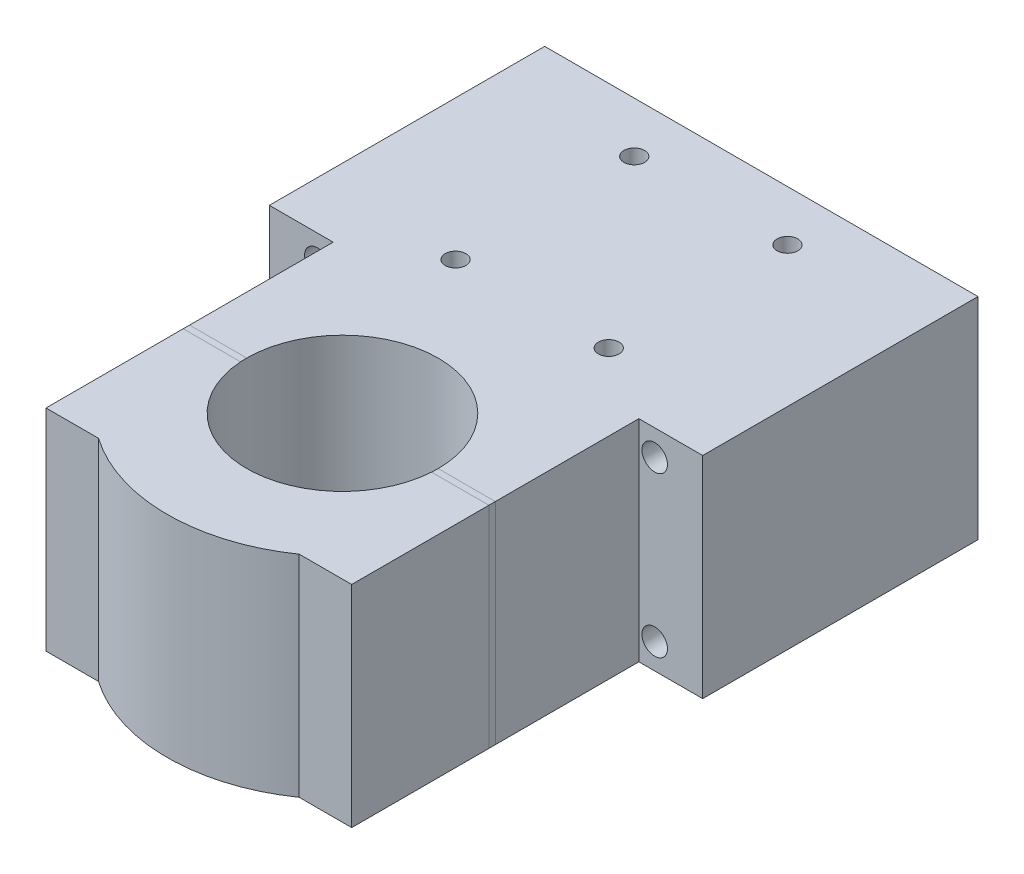
ISO-10303-21;
HEADER;
FILE_DESCRIPTION(('STEP AP214'),'2;1');
FILE_NAME('part.step','',(''),(''),'','','');
FILE_SCHEMA(('AUTOMOTIVE_DESIGN { 1 0 10303 214 1 1 1 1 }'));
ENDSEC;
DATA;
#1=APPLICATION_CONTEXT('core data for automotive mechanical design processes');
#2=APPLICATION_PROTOCOL_DEFINITION('international standard','automotive_design',2000,#1);
#3=PRODUCT_CONTEXT('',#1,'mechanical');
#4=PRODUCT('Part','Part','',(#3));
#5=PRODUCT_RELATED_PRODUCT_CATEGORY('part','',(#4));
#6=PRODUCT_DEFINITION_FORMATION('','',#4);
#7=PRODUCT_DEFINITION_CONTEXT('part definition',#1,'design');
#8=PRODUCT_DEFINITION('design','',#6,#7);
#9=PRODUCT_DEFINITION_SHAPE('','',#8);
#10=(LENGTH_UNIT() NAMED_UNIT(*) SI_UNIT(.MILLI.,.METRE.));
#11=(NAMED_UNIT(*) PLANE_ANGLE_UNIT() SI_UNIT($,.RADIAN.));
#12=(NAMED_UNIT(*) SI_UNIT($,.STERADIAN.) SOLID_ANGLE_UNIT());
#13=UNCERTAINTY_MEASURE_WITH_UNIT(LENGTH_MEASURE(1.E-05),#10,'distance_accuracy_value','');
#14=(GEOMETRIC_REPRESENTATION_CONTEXT(3) GLOBAL_UNCERTAINTY_ASSIGNED_CONTEXT((#13)) GLOBAL_UNIT_ASSIGNED_CONTEXT((#10,
#11,#12)) REPRESENTATION_CONTEXT('',''));
#15=CARTESIAN_POINT('',(0.,0.,0.));
#16=DIRECTION('',(0.,0.,1.));
#17=DIRECTION('',(1.,0.,0.));
#18=AXIS2_PLACEMENT_3D('',#15,#16,#17);
#19=CARTESIAN_POINT('',(10.5911995216749,33.,-9.67526259329469));
#20=DIRECTION('',(1.,0.,0.));
#21=DIRECTION('',(0.,0.,-1.));
#22=AXIS2_PLACEMENT_3D('',#19,#20,#21);
#23=PLANE('',#22);
#24=DIRECTION('',(0.,0.,1.));
#25=VECTOR('',#24,1.);
#26=CARTESIAN_POINT('',(10.5911995216749,0.,-9.67526259329469));
#27=LINE('',#26,#25);
#28=CARTESIAN_POINT('',(10.5911995216749,0.,13.8247374067053));
#29=VERTEX_POINT('',#28);
#30=CARTESIAN_POINT('',(10.5911995216749,0.,35.3247374067053));
#31=VERTEX_POINT('',#30);
#32=EDGE_CURVE('E326',#29,#31,#27,.T.);
#33=ORIENTED_EDGE('',*,*,#32,.F.);
#34=DIRECTION('',(0.,1.,0.));
#35=VECTOR('',#34,1.);
#36=CARTESIAN_POINT('',(10.5911995216749,33.,13.8247374067053));
#37=LINE('',#36,#35);
#38=CARTESIAN_POINT('',(10.5911995216749,33.,13.8247374067053));
#39=VERTEX_POINT('',#38);
#40=EDGE_CURVE('E12',#29,#39,#37,.T.);
#41=ORIENTED_EDGE('',*,*,#40,.T.);
#42=DIRECTION('',(0.,0.,1.));
#43=VECTOR('',#42,1.);
#44=CARTESIAN_POINT('',(10.5911995216749,33.,-9.67526259329469));
#45=LINE('',#44,#43);
#46=CARTESIAN_POINT('',(10.5911995216749,33.,35.3247374067053));
#47=VERTEX_POINT('',#46);
#48=EDGE_CURVE('E291',#39,#47,#45,.T.);
#49=ORIENTED_EDGE('',*,*,#48,.T.);
#50=DIRECTION('',(0.,-1.,0.));
#51=VECTOR('',#50,1.);
#52=CARTESIAN_POINT('',(10.5911995216749,33.,35.3247374067053));
#53=LINE('',#52,#51);
#54=EDGE_CURVE('E344',#47,#31,#53,.T.);
#55=ORIENTED_EDGE('',*,*,#54,.T.);
#56=EDGE_LOOP('',(#33,#41,#49,#55));
#57=FACE_BOUND('',#56,.T.);
#58=ADVANCED_FACE('F74',(#57),#23,.T.);
#59=ORIENTED_EDGE('',*,*,#40,.F.);
#60=CARTESIAN_POINT('',(10.5911995216749,0.,12.8247374067053));
#61=VERTEX_POINT('',#60);
#62=EDGE_CURVE('E331',#61,#29,#27,.T.);
#63=ORIENTED_EDGE('',*,*,#62,.F.);
#64=DIRECTION('',(0.,1.,0.));
#65=VECTOR('',#64,1.);
#66=CARTESIAN_POINT('',(10.5911995216749,33.,12.8247374067053));
#67=LINE('',#66,#65);
#68=CARTESIAN_POINT('',(10.5911995216749,33.,12.8247374067053));
#69=VERTEX_POINT('',#68);
#70=EDGE_CURVE('E83',#61,#69,#67,.T.);
#71=ORIENTED_EDGE('',*,*,#70,.T.);
#72=EDGE_CURVE('E296',#69,#39,#45,.T.);
#73=ORIENTED_EDGE('',*,*,#72,.T.);
#74=EDGE_LOOP('',(#59,#63,#71,#73));
#75=FACE_BOUND('',#74,.T.);
#76=ADVANCED_FACE('F385',(#75),#23,.T.);
#77=CARTESIAN_POINT('',(-13.3585479466309,33.,12.8247374067053));
#78=DIRECTION('',(0.,1.,0.));
#79=DIRECTION('',(0.,0.,1.));
#80=AXIS2_PLACEMENT_3D('',#77,#78,#79);
#81=PLANE('',#80);
#82=CARTESIAN_POINT('',(-13.3585479466309,33.,12.8247374067053));
#83=DIRECTION('',(0.,1.,0.));
#84=DIRECTION('',(0.,0.,1.));
#85=AXIS2_PLACEMENT_3D('',#82,#83,#84);
#86=CIRCLE('',#85,15.);
#87=CARTESIAN_POINT('',(1.60808160046484,33.,13.8247374067053));
#88=VERTEX_POINT('',#87);
#89=CARTESIAN_POINT('',(1.64145205336907,33.,12.8247374067053));
#90=VERTEX_POINT('',#89);
#91=EDGE_CURVE('E266',#88,#90,#86,.T.);
#92=ORIENTED_EDGE('',*,*,#91,.F.);
#93=DIRECTION('',(1.,0.,0.));
#94=VECTOR('',#93,1.);
#95=CARTESIAN_POINT('',(-13.3585479466309,33.,13.8247374067053));
#96=LINE('',#95,#94);
#97=EDGE_CURVE('E379',#88,#39,#96,.T.);
#98=ORIENTED_EDGE('',*,*,#97,.T.);
#99=ORIENTED_EDGE('',*,*,#72,.F.);
#100=DIRECTION('',(-1.,0.,0.));
#101=VECTOR('',#100,1.);
#102=CARTESIAN_POINT('',(-13.3585479466309,33.,12.8247374067053));
#103=LINE('',#102,#101);
#104=EDGE_CURVE('E372',#69,#90,#103,.T.);
#105=ORIENTED_EDGE('',*,*,#104,.T.);
#106=EDGE_LOOP('',(#92,#98,#99,#105));
#107=FACE_BOUND('',#106,.T.);
#108=ADVANCED_FACE('F395',(#107),#81,.T.);
#109=ORIENTED_EDGE('',*,*,#97,.F.);
#110=CARTESIAN_POINT('',(-28.3251774937267,33.,13.8247374067053));
#111=VERTEX_POINT('',#110);
#112=EDGE_CURVE('E265',#111,#88,#86,.T.);
#113=ORIENTED_EDGE('',*,*,#112,.F.);
#114=DIRECTION('',(-1.,0.,0.));
#115=VECTOR('',#114,1.);
#116=CARTESIAN_POINT('',(-13.3585479466309,33.,13.8247374067053));
#117=LINE('',#116,#115);
#118=CARTESIAN_POINT('',(-37.3082954149368,33.,13.8247374067053));
#119=VERTEX_POINT('',#118);
#120=EDGE_CURVE('E376',#111,#119,#117,.T.);
#121=ORIENTED_EDGE('',*,*,#120,.T.);
#122=DIRECTION('',(0.,0.,1.));
#123=VECTOR('',#122,1.);
#124=CARTESIAN_POINT('',(-37.3082954149368,33.,-9.67526259329467));
#125=LINE('',#124,#123);
#126=CARTESIAN_POINT('',(-37.3082954149368,33.,35.3247374067053));
#127=VERTEX_POINT('',#126);
#128=EDGE_CURVE('E275',#119,#127,#125,.T.);
#129=ORIENTED_EDGE('',*,*,#128,.T.);
#130=DIRECTION('',(1.,0.,0.));
#131=VECTOR('',#130,1.);
#132=CARTESIAN_POINT('',(-37.3082954149368,33.,35.3247374067053));
#133=LINE('',#132,#131);
#134=CARTESIAN_POINT('',(-29.0823717841637,33.,35.3247374067053));
#135=VERTEX_POINT('',#134);
#136=EDGE_CURVE('E280',#127,#135,#133,.T.);
#137=ORIENTED_EDGE('',*,*,#136,.T.);
#138=CARTESIAN_POINT('',(-13.3585479466309,33.,12.8247374067053));
#139=DIRECTION('',(0.,1.,0.));
#140=DIRECTION('',(0.,0.,1.));
#141=AXIS2_PLACEMENT_3D('',#138,#139,#140);
#142=CIRCLE('',#141,27.4497474683058);
#143=CARTESIAN_POINT('',(2.36527589090183,33.,35.3247374067053));
#144=VERTEX_POINT('',#143);
#145=EDGE_CURVE('E284',#135,#144,#142,.T.);
#146=ORIENTED_EDGE('',*,*,#145,.T.);
#147=DIRECTION('',(-1.,0.,0.));
#148=VECTOR('',#147,1.);
#149=CARTESIAN_POINT('',(10.5911995216749,33.,35.3247374067053));
#150=LINE('',#149,#148);
#151=EDGE_CURVE('E287',#47,#144,#150,.T.);
#152=ORIENTED_EDGE('',*,*,#151,.F.);
#153=ORIENTED_EDGE('',*,*,#48,.F.);
#154=EDGE_LOOP('',(#109,#113,#121,#129,#137,#146,#152,#153));
#155=FACE_BOUND('',#154,.T.);
#156=ADVANCED_FACE('F462',(#155),#81,.T.);
#157=ORIENTED_EDGE('',*,*,#120,.F.);
#158=CARTESIAN_POINT('',(-28.3585479466309,33.,12.8247374067053));
#159=VERTEX_POINT('',#158);
#160=EDGE_CURVE('E260',#159,#111,#86,.T.);
#161=ORIENTED_EDGE('',*,*,#160,.F.);
#162=DIRECTION('',(-1.,0.,0.));
#163=VECTOR('',#162,1.);
#164=CARTESIAN_POINT('',(-13.3585479466309,33.,12.8247374067053));
#165=LINE('',#164,#163);
#166=CARTESIAN_POINT('',(-37.3082954149368,33.,12.8247374067053));
#167=VERTEX_POINT('',#166);
#168=EDGE_CURVE('E369',#159,#167,#165,.T.);
#169=ORIENTED_EDGE('',*,*,#168,.T.);
#170=EDGE_CURVE('E281',#167,#119,#125,.T.);
#171=ORIENTED_EDGE('',*,*,#170,.T.);
#172=EDGE_LOOP('',(#157,#161,#169,#171));
#173=FACE_BOUND('',#172,.T.);
#174=ADVANCED_FACE('F415',(#173),#81,.T.);
#175=CARTESIAN_POINT('',(-37.3082954149368,33.,-9.67526259329467));
#176=DIRECTION('',(1.,0.,0.));
#177=DIRECTION('',(0.,0.,-1.));
#178=AXIS2_PLACEMENT_3D('',#175,#176,#177);
#179=PLANE('',#178);
#180=DIRECTION('',(0.,-1.,0.));
#181=VECTOR('',#180,1.);
#182=CARTESIAN_POINT('',(-37.3082954149368,33.,13.8247374067053));
#183=LINE('',#182,#181);
#184=CARTESIAN_POINT('',(-37.3082954149368,0.,13.8247374067053));
#185=VERTEX_POINT('',#184);
#186=EDGE_CURVE('E366',#119,#185,#183,.T.);
#187=ORIENTED_EDGE('',*,*,#186,.F.);
#188=ORIENTED_EDGE('',*,*,#170,.F.);
#189=DIRECTION('',(0.,-1.,0.));
#190=VECTOR('',#189,1.);
#191=CARTESIAN_POINT('',(-37.3082954149368,33.,12.8247374067053));
#192=LINE('',#191,#190);
#193=CARTESIAN_POINT('',(-37.3082954149368,0.,12.8247374067053));
#194=VERTEX_POINT('',#193);
#195=EDGE_CURVE('E363',#167,#194,#192,.T.);
#196=ORIENTED_EDGE('',*,*,#195,.T.);
#197=DIRECTION('',(0.,0.,1.));
#198=VECTOR('',#197,1.);
#199=CARTESIAN_POINT('',(-37.3082954149368,0.,-9.67526259329467));
#200=LINE('',#199,#198);
#201=EDGE_CURVE('E315',#194,#185,#200,.T.);
#202=ORIENTED_EDGE('',*,*,#201,.T.);
#203=EDGE_LOOP('',(#187,#188,#196,#202));
#204=FACE_BOUND('',#203,.T.);
#205=ADVANCED_FACE('F481',(#204),#179,.F.);
#206=ORIENTED_EDGE('',*,*,#195,.F.);
#207=CARTESIAN_POINT('',(-37.3082954149368,33.,-9.67526259329467));
#208=VERTEX_POINT('',#207);
#209=EDGE_CURVE('E276',#208,#167,#125,.T.);
#210=ORIENTED_EDGE('',*,*,#209,.F.);
#211=DIRECTION('',(0.,-1.,0.));
#212=VECTOR('',#211,1.);
#213=CARTESIAN_POINT('',(-37.3082954149368,33.,-9.67526259329467));
#214=LINE('',#213,#212);
#215=CARTESIAN_POINT('',(-37.3082954149368,0.,-9.67526259329467));
#216=VERTEX_POINT('',#215);
#217=EDGE_CURVE('E359',#208,#216,#214,.T.);
#218=ORIENTED_EDGE('',*,*,#217,.T.);
#219=EDGE_CURVE('E310',#216,#194,#200,.T.);
#220=ORIENTED_EDGE('',*,*,#219,.T.);
#221=EDGE_LOOP('',(#206,#210,#218,#220));
#222=FACE_BOUND('',#221,.T.);
#223=ADVANCED_FACE('F410',(#222),#179,.F.);
#224=CARTESIAN_POINT('',(-1.35829541493676,33.,-16.8999709205909));
#225=DIRECTION('',(0.,1.,0.));
#226=DIRECTION('',(0.,0.,1.));
#227=AXIS2_PLACEMENT_3D('',#224,#225,#226);
#228=CIRCLE('',#227,1.62);
#229=CARTESIAN_POINT('',(-1.35829541493676,33.,-15.2799709205909));
#230=VERTEX_POINT('',#229);
#231=EDGE_CURVE('E809',#230,#230,#228,.T.);
#232=ORIENTED_EDGE('',*,*,#231,.F.);
#233=EDGE_LOOP('',(#232));
#234=FACE_BOUND('',#233,.T.);
#235=CARTESIAN_POINT('',(-25.3582954149368,33.,-44.8999709205909));
#236=DIRECTION('',(0.,1.,0.));
#237=DIRECTION('',(0.,0.,1.));
#238=AXIS2_PLACEMENT_3D('',#235,#236,#237);
#239=CIRCLE('',#238,1.62);
#240=CARTESIAN_POINT('',(-25.3582954149368,33.,-43.2799709205909));
#241=VERTEX_POINT('',#240);
#242=EDGE_CURVE('E824',#241,#241,#239,.T.);
#243=ORIENTED_EDGE('',*,*,#242,.F.);
#244=EDGE_LOOP('',(#243));
#245=FACE_BOUND('',#244,.T.);
#246=CARTESIAN_POINT('',(-1.35829541493676,33.,-44.8999709205909));
#247=DIRECTION('',(0.,1.,0.));
#248=DIRECTION('',(0.,0.,1.));
#249=AXIS2_PLACEMENT_3D('',#246,#247,#248);
#250=CIRCLE('',#249,1.62);
#251=CARTESIAN_POINT('',(-1.35829541493676,33.,-43.2799709205909));
#252=VERTEX_POINT('',#251);
#253=EDGE_CURVE('E818',#252,#252,#250,.T.);
#254=ORIENTED_EDGE('',*,*,#253,.F.);
#255=EDGE_LOOP('',(#254));
#256=FACE_BOUND('',#255,.T.);
#257=CARTESIAN_POINT('',(-25.3582954149368,33.,-16.8999709205909));
#258=DIRECTION('',(0.,1.,0.));
#259=DIRECTION('',(0.,0.,1.));
#260=AXIS2_PLACEMENT_3D('',#257,#258,#259);
#261=CIRCLE('',#260,1.62);
#262=CARTESIAN_POINT('',(-25.3582954149368,33.,-15.2799709205909));
#263=VERTEX_POINT('',#262);
#264=EDGE_CURVE('E222',#263,#263,#261,.T.);
#265=ORIENTED_EDGE('',*,*,#264,.F.);
#266=EDGE_LOOP('',(#265));
#267=FACE_BOUND('',#266,.T.);
#268=ORIENTED_EDGE('',*,*,#104,.F.);
#269=CARTESIAN_POINT('',(10.5911995216749,33.,-9.67526259329469));
#270=VERTEX_POINT('',#269);
#271=EDGE_CURVE('E292',#270,#69,#45,.T.);
#272=ORIENTED_EDGE('',*,*,#271,.F.);
#273=DIRECTION('',(1.,0.,0.));
#274=VECTOR('',#273,1.);
#275=CARTESIAN_POINT('',(10.5911995216749,33.,-9.67526259329469));
#276=LINE('',#275,#274);
#277=CARTESIAN_POINT('',(20.5911995216749,33.,-9.67526259329469));
#278=VERTEX_POINT('',#277);
#279=EDGE_CURVE('E295',#270,#278,#276,.T.);
#280=ORIENTED_EDGE('',*,*,#279,.T.);
#281=DIRECTION('',(0.,0.,1.));
#282=VECTOR('',#281,1.);
#283=CARTESIAN_POINT('',(20.5911995216749,33.,-17.8159661108826));
#284=LINE('',#283,#282);
#285=CARTESIAN_POINT('',(20.5911995216749,33.,-52.8159661108826));
#286=VERTEX_POINT('',#285);
#287=EDGE_CURVE('E299',#286,#278,#284,.T.);
#288=ORIENTED_EDGE('',*,*,#287,.F.);
#289=DIRECTION('',(-1.,0.,0.));
#290=VECTOR('',#289,1.);
#291=CARTESIAN_POINT('',(-47.3082954149368,33.,-52.8159661108826));
#292=LINE('',#291,#290);
#293=CARTESIAN_POINT('',(-47.3082954149368,33.,-52.8159661108826));
#294=VERTEX_POINT('',#293);
#295=EDGE_CURVE('E208',#286,#294,#292,.T.);
#296=ORIENTED_EDGE('',*,*,#295,.T.);
#297=DIRECTION('',(0.,0.,1.));
#298=VECTOR('',#297,1.);
#299=CARTESIAN_POINT('',(-47.3082954149368,33.,-17.8159661108826));
#300=LINE('',#299,#298);
#301=CARTESIAN_POINT('',(-47.3082954149368,33.,-9.67526259329467));
#302=VERTEX_POINT('',#301);
#303=EDGE_CURVE('E302',#294,#302,#300,.T.);
#304=ORIENTED_EDGE('',*,*,#303,.T.);
#305=DIRECTION('',(1.,0.,0.));
#306=VECTOR('',#305,1.);
#307=CARTESIAN_POINT('',(-47.3082954149368,33.,-9.67526259329467));
#308=LINE('',#307,#306);
#309=EDGE_CURVE('E271',#302,#208,#308,.T.);
#310=ORIENTED_EDGE('',*,*,#309,.T.);
#311=ORIENTED_EDGE('',*,*,#209,.T.);
#312=ORIENTED_EDGE('',*,*,#168,.F.);
#313=EDGE_CURVE('E267',#90,#159,#86,.T.);
#314=ORIENTED_EDGE('',*,*,#313,.F.);
#315=EDGE_LOOP('',(#268,#272,#280,#288,#296,#304,#310,#311,#312,#314));
#316=FACE_BOUND('',#315,.T.);
#317=ADVANCED_FACE('F391',(#234,#245,#256,#267,#316),#81,.T.);
#318=CARTESIAN_POINT('',(-13.3585479466309,0.,12.8247374067053));
#319=DIRECTION('',(0.,1.,0.));
#320=DIRECTION('',(0.,0.,1.));
#321=AXIS2_PLACEMENT_3D('',#318,#319,#320);
#322=PLANE('',#321);
#323=DIRECTION('',(1.,0.,0.));
#324=VECTOR('',#323,1.);
#325=CARTESIAN_POINT('',(-47.3082954149368,0.,-9.67526259329467));
#326=LINE('',#325,#324);
#327=CARTESIAN_POINT('',(-47.3082954149368,0.,-9.67526259329467));
#328=VERTEX_POINT('',#327);
#329=EDGE_CURVE('E264',#328,#216,#326,.T.);
#330=ORIENTED_EDGE('',*,*,#329,.F.);
#331=DIRECTION('',(0.,0.,1.));
#332=VECTOR('',#331,1.);
#333=CARTESIAN_POINT('',(-47.3082954149368,0.,-17.8159661108826));
#334=LINE('',#333,#332);
#335=CARTESIAN_POINT('',(-47.3082954149368,0.,-52.8159661108826));
#336=VERTEX_POINT('',#335);
#337=EDGE_CURVE('E199',#336,#328,#334,.T.);
#338=ORIENTED_EDGE('',*,*,#337,.F.);
#339=DIRECTION('',(-1.,0.,0.));
#340=VECTOR('',#339,1.);
#341=CARTESIAN_POINT('',(-47.3082954149368,0.,-52.8159661108826));
#342=LINE('',#341,#340);
#343=CARTESIAN_POINT('',(20.5911995216749,0.,-52.8159661108826));
#344=VERTEX_POINT('',#343);
#345=EDGE_CURVE('E206',#344,#336,#342,.T.);
#346=ORIENTED_EDGE('',*,*,#345,.F.);
#347=DIRECTION('',(0.,0.,1.));
#348=VECTOR('',#347,1.);
#349=CARTESIAN_POINT('',(20.5911995216749,0.,-17.8159661108826));
#350=LINE('',#349,#348);
#351=CARTESIAN_POINT('',(20.5911995216749,0.,-9.67526259329469));
#352=VERTEX_POINT('',#351);
#353=EDGE_CURVE('E186',#344,#352,#350,.T.);
#354=ORIENTED_EDGE('',*,*,#353,.T.);
#355=DIRECTION('',(1.,0.,0.));
#356=VECTOR('',#355,1.);
#357=CARTESIAN_POINT('',(10.5911995216749,0.,-9.67526259329469));
#358=LINE('',#357,#356);
#359=CARTESIAN_POINT('',(10.5911995216749,0.,-9.67526259329469));
#360=VERTEX_POINT('',#359);
#361=EDGE_CURVE('E200',#360,#352,#358,.T.);
#362=ORIENTED_EDGE('',*,*,#361,.F.);
#363=EDGE_CURVE('E327',#360,#61,#27,.T.);
#364=ORIENTED_EDGE('',*,*,#363,.T.);
#365=ORIENTED_EDGE('',*,*,#62,.T.);
#366=ORIENTED_EDGE('',*,*,#32,.T.);
#367=DIRECTION('',(-1.,0.,0.));
#368=VECTOR('',#367,1.);
#369=CARTESIAN_POINT('',(10.5911995216749,0.,35.3247374067053));
#370=LINE('',#369,#368);
#371=CARTESIAN_POINT('',(2.36527589090183,0.,35.3247374067053));
#372=VERTEX_POINT('',#371);
#373=EDGE_CURVE('E322',#31,#372,#370,.T.);
#374=ORIENTED_EDGE('',*,*,#373,.T.);
#375=CARTESIAN_POINT('',(-13.3585479466309,0.,12.8247374067053));
#376=DIRECTION('',(0.,1.,0.));
#377=DIRECTION('',(0.,0.,1.));
#378=AXIS2_PLACEMENT_3D('',#375,#376,#377);
#379=CIRCLE('',#378,27.4497474683058);
#380=CARTESIAN_POINT('',(-29.0823717841637,0.,35.3247374067053));
#381=VERTEX_POINT('',#380);
#382=EDGE_CURVE('E318',#381,#372,#379,.T.);
#383=ORIENTED_EDGE('',*,*,#382,.F.);
#384=DIRECTION('',(1.,0.,0.));
#385=VECTOR('',#384,1.);
#386=CARTESIAN_POINT('',(-37.3082954149368,0.,35.3247374067053));
#387=LINE('',#386,#385);
#388=CARTESIAN_POINT('',(-37.3082954149368,0.,35.3247374067053));
#389=VERTEX_POINT('',#388);
#390=EDGE_CURVE('E314',#389,#381,#387,.T.);
#391=ORIENTED_EDGE('',*,*,#390,.F.);
#392=EDGE_CURVE('E309',#185,#389,#200,.T.);
#393=ORIENTED_EDGE('',*,*,#392,.F.);
#394=ORIENTED_EDGE('',*,*,#201,.F.);
#395=ORIENTED_EDGE('',*,*,#219,.F.);
#396=EDGE_LOOP('',(#330,#338,#346,#354,#362,#364,#365,#366,#374,#383,#391,#393,#394,#395));
#397=FACE_BOUND('',#396,.T.);
#398=CARTESIAN_POINT('',(-13.3585479466309,0.,12.8247374067053));
#399=DIRECTION('',(0.,1.,0.));
#400=DIRECTION('',(0.,0.,1.));
#401=AXIS2_PLACEMENT_3D('',#398,#399,#400);
#402=CIRCLE('',#401,15.);
#403=CARTESIAN_POINT('',(-13.3585479466309,0.,27.8247374067053));
#404=VERTEX_POINT('',#403);
#405=EDGE_CURVE('E259',#404,#404,#402,.T.);
#406=ORIENTED_EDGE('',*,*,#405,.T.);
#407=EDGE_LOOP('',(#406));
#408=FACE_BOUND('',#407,.T.);
#409=ADVANCED_FACE('F213',(#397,#408),#322,.F.);
#410=CARTESIAN_POINT('',(-47.3082954149368,33.,-9.67526259329467));
#411=DIRECTION('',(0.,0.,-1.));
#412=DIRECTION('',(-1.,0.,0.));
#413=AXIS2_PLACEMENT_3D('',#410,#411,#412);
#414=PLANE('',#413);
#415=CARTESIAN_POINT('',(-39.7882954149368,29.,-9.67526259329467));
#416=DIRECTION('',(0.,0.,-1.));
#417=DIRECTION('',(-1.,0.,0.));
#418=AXIS2_PLACEMENT_3D('',#415,#416,#417);
#419=CIRCLE('',#418,2.);
#420=CARTESIAN_POINT('',(-41.7882954149368,29.,-9.67526259329467));
#421=VERTEX_POINT('',#420);
#422=EDGE_CURVE('E247',#421,#421,#419,.T.);
#423=ORIENTED_EDGE('',*,*,#422,.T.);
#424=EDGE_LOOP('',(#423));
#425=FACE_BOUND('',#424,.T.);
#426=CARTESIAN_POINT('',(-39.7882954149368,4.,-9.67526259329467));
#427=DIRECTION('',(0.,0.,-1.));
#428=DIRECTION('',(-1.,0.,0.));
#429=AXIS2_PLACEMENT_3D('',#426,#427,#428);
#430=CIRCLE('',#429,2.);
#431=CARTESIAN_POINT('',(-41.7882954149368,4.,-9.67526259329467));
#432=VERTEX_POINT('',#431);
#433=EDGE_CURVE('E240',#432,#432,#430,.T.);
#434=ORIENTED_EDGE('',*,*,#433,.T.);
#435=EDGE_LOOP('',(#434));
#436=FACE_BOUND('',#435,.T.);
#437=ORIENTED_EDGE('',*,*,#329,.T.);
#438=ORIENTED_EDGE('',*,*,#217,.F.);
#439=ORIENTED_EDGE('',*,*,#309,.F.);
#440=DIRECTION('',(0.,-1.,0.));
#441=VECTOR('',#440,1.);
#442=CARTESIAN_POINT('',(-47.3082954149368,33.,-9.67526259329467));
#443=LINE('',#442,#441);
#444=EDGE_CURVE('E305',#302,#328,#443,.T.);
#445=ORIENTED_EDGE('',*,*,#444,.T.);
#446=EDGE_LOOP('',(#437,#438,#439,#445));
#447=FACE_BOUND('',#446,.T.);
#448=ADVANCED_FACE('F76',(#425,#436,#447),#414,.F.);
#449=ORIENTED_EDGE('',*,*,#128,.F.);
#450=ORIENTED_EDGE('',*,*,#186,.T.);
#451=ORIENTED_EDGE('',*,*,#392,.T.);
#452=DIRECTION('',(0.,-1.,0.));
#453=VECTOR('',#452,1.);
#454=CARTESIAN_POINT('',(-37.3082954149368,33.,35.3247374067053));
#455=LINE('',#454,#453);
#456=EDGE_CURVE('E355',#127,#389,#455,.T.);
#457=ORIENTED_EDGE('',*,*,#456,.F.);
#458=EDGE_LOOP('',(#449,#450,#451,#457));
#459=FACE_BOUND('',#458,.T.);
#460=ADVANCED_FACE('F478',(#459),#179,.F.);
#461=CARTESIAN_POINT('',(-37.3082954149368,33.,35.3247374067053));
#462=DIRECTION('',(0.,0.,-1.));
#463=DIRECTION('',(-1.,0.,0.));
#464=AXIS2_PLACEMENT_3D('',#461,#462,#463);
#465=PLANE('',#464);
#466=ORIENTED_EDGE('',*,*,#390,.T.);
#467=DIRECTION('',(0.,-1.,0.));
#468=VECTOR('',#467,1.);
#469=CARTESIAN_POINT('',(-29.0823717841637,33.,35.3247374067053));
#470=LINE('',#469,#468);
#471=EDGE_CURVE('E351',#135,#381,#470,.T.);
#472=ORIENTED_EDGE('',*,*,#471,.F.);
#473=ORIENTED_EDGE('',*,*,#136,.F.);
#474=ORIENTED_EDGE('',*,*,#456,.T.);
#475=EDGE_LOOP('',(#466,#472,#473,#474));
#476=FACE_BOUND('',#475,.T.);
#477=ADVANCED_FACE('F474',(#476),#465,.F.);
#478=CARTESIAN_POINT('',(-13.3585479466309,33.,12.8247374067053));
#479=DIRECTION('',(0.,-1.,0.));
#480=DIRECTION('',(0.,0.,-1.));
#481=AXIS2_PLACEMENT_3D('',#478,#479,#480);
#482=CYLINDRICAL_SURFACE('',#481,27.4497474683058);
#483=ORIENTED_EDGE('',*,*,#382,.T.);
#484=DIRECTION('',(0.,-1.,0.));
#485=VECTOR('',#484,1.);
#486=CARTESIAN_POINT('',(2.36527589090183,33.,35.3247374067053));
#487=LINE('',#486,#485);
#488=EDGE_CURVE('E348',#144,#372,#487,.T.);
#489=ORIENTED_EDGE('',*,*,#488,.F.);
#490=ORIENTED_EDGE('',*,*,#145,.F.);
#491=ORIENTED_EDGE('',*,*,#471,.T.);
#492=EDGE_LOOP('',(#483,#489,#490,#491));
#493=FACE_BOUND('',#492,.T.);
#494=ADVANCED_FACE('F468',(#493),#482,.T.);
#495=CARTESIAN_POINT('',(10.5911995216749,33.,35.3247374067053));
#496=DIRECTION('',(0.,0.,1.));
#497=DIRECTION('',(1.,0.,0.));
#498=AXIS2_PLACEMENT_3D('',#495,#496,#497);
#499=PLANE('',#498);
#500=ORIENTED_EDGE('',*,*,#373,.F.);
#501=ORIENTED_EDGE('',*,*,#54,.F.);
#502=ORIENTED_EDGE('',*,*,#151,.T.);
#503=ORIENTED_EDGE('',*,*,#488,.T.);
#504=EDGE_LOOP('',(#500,#501,#502,#503));
#505=FACE_BOUND('',#504,.T.);
#506=ADVANCED_FACE('F461',(#505),#499,.T.);
#507=ORIENTED_EDGE('',*,*,#70,.F.);
#508=ORIENTED_EDGE('',*,*,#363,.F.);
#509=DIRECTION('',(0.,-1.,0.));
#510=VECTOR('',#509,1.);
#511=CARTESIAN_POINT('',(10.5911995216749,33.,-9.67526259329469));
#512=LINE('',#511,#510);
#513=EDGE_CURVE('E341',#270,#360,#512,.T.);
#514=ORIENTED_EDGE('',*,*,#513,.F.);
#515=ORIENTED_EDGE('',*,*,#271,.T.);
#516=EDGE_LOOP('',(#507,#508,#514,#515));
#517=FACE_BOUND('',#516,.T.);
#518=ADVANCED_FACE('F398',(#517),#23,.T.);
#519=CARTESIAN_POINT('',(10.5911995216749,33.,-9.67526259329469));
#520=DIRECTION('',(0.,0.,-1.));
#521=DIRECTION('',(-1.,0.,0.));
#522=AXIS2_PLACEMENT_3D('',#519,#520,#521);
#523=PLANE('',#522);
#524=CARTESIAN_POINT('',(13.0711995216749,4.,-9.67526259329469));
#525=DIRECTION('',(0.,0.,-1.));
#526=DIRECTION('',(-1.,0.,0.));
#527=AXIS2_PLACEMENT_3D('',#524,#525,#526);
#528=CIRCLE('',#527,2.);
#529=CARTESIAN_POINT('',(11.0711995216749,4.,-9.67526259329469));
#530=VERTEX_POINT('',#529);
#531=EDGE_CURVE('E255',#530,#530,#528,.T.);
#532=ORIENTED_EDGE('',*,*,#531,.T.);
#533=EDGE_LOOP('',(#532));
#534=FACE_BOUND('',#533,.T.);
#535=CARTESIAN_POINT('',(13.0711995216749,29.,-9.67526259329469));
#536=DIRECTION('',(0.,0.,-1.));
#537=DIRECTION('',(-1.,0.,0.));
#538=AXIS2_PLACEMENT_3D('',#535,#536,#537);
#539=CIRCLE('',#538,2.);
#540=CARTESIAN_POINT('',(11.0711995216749,29.,-9.67526259329469));
#541=VERTEX_POINT('',#540);
#542=EDGE_CURVE('E251',#541,#541,#539,.T.);
#543=ORIENTED_EDGE('',*,*,#542,.T.);
#544=EDGE_LOOP('',(#543));
#545=FACE_BOUND('',#544,.T.);
#546=ORIENTED_EDGE('',*,*,#361,.T.);
#547=DIRECTION('',(0.,-1.,0.));
#548=VECTOR('',#547,1.);
#549=CARTESIAN_POINT('',(20.5911995216749,33.,-9.67526259329469));
#550=LINE('',#549,#548);
#551=EDGE_CURVE('E193',#278,#352,#550,.T.);
#552=ORIENTED_EDGE('',*,*,#551,.F.);
#553=ORIENTED_EDGE('',*,*,#279,.F.);
#554=ORIENTED_EDGE('',*,*,#513,.T.);
#555=EDGE_LOOP('',(#546,#552,#553,#554));
#556=FACE_BOUND('',#555,.T.);
#557=ADVANCED_FACE('F401',(#534,#545,#556),#523,.F.);
#558=CARTESIAN_POINT('',(20.5911995216749,33.,-17.8159661108826));
#559=DIRECTION('',(1.,0.,0.));
#560=DIRECTION('',(0.,0.,-1.));
#561=AXIS2_PLACEMENT_3D('',#558,#559,#560);
#562=PLANE('',#561);
#563=ORIENTED_EDGE('',*,*,#353,.F.);
#564=DIRECTION('',(0.,1.,0.));
#565=VECTOR('',#564,1.);
#566=CARTESIAN_POINT('',(20.5911995216749,0.,-52.8159661108826));
#567=LINE('',#566,#565);
#568=EDGE_CURVE('E190',#344,#286,#567,.T.);
#569=ORIENTED_EDGE('',*,*,#568,.T.);
#570=ORIENTED_EDGE('',*,*,#287,.T.);
#571=ORIENTED_EDGE('',*,*,#551,.T.);
#572=EDGE_LOOP('',(#563,#569,#570,#571));
#573=FACE_BOUND('',#572,.T.);
#574=ADVANCED_FACE('F188',(#573),#562,.T.);
#575=CARTESIAN_POINT('',(-47.3082954149368,33.,-17.8159661108826));
#576=DIRECTION('',(1.,0.,0.));
#577=DIRECTION('',(0.,0.,-1.));
#578=AXIS2_PLACEMENT_3D('',#575,#576,#577);
#579=PLANE('',#578);
#580=ORIENTED_EDGE('',*,*,#337,.T.);
#581=ORIENTED_EDGE('',*,*,#444,.F.);
#582=ORIENTED_EDGE('',*,*,#303,.F.);
#583=DIRECTION('',(0.,1.,0.));
#584=VECTOR('',#583,1.);
#585=CARTESIAN_POINT('',(-47.3082954149368,0.,-52.8159661108826));
#586=LINE('',#585,#584);
#587=EDGE_CURVE('E210',#336,#294,#586,.T.);
#588=ORIENTED_EDGE('',*,*,#587,.F.);
#589=EDGE_LOOP('',(#580,#581,#582,#588));
#590=FACE_BOUND('',#589,.T.);
#591=ADVANCED_FACE('F406',(#590),#579,.F.);
#592=CARTESIAN_POINT('',(-13.3585479466309,33.,12.8247374067053));
#593=DIRECTION('',(0.,-1.,0.));
#594=DIRECTION('',(0.,0.,-1.));
#595=AXIS2_PLACEMENT_3D('',#592,#593,#594);
#596=CYLINDRICAL_SURFACE('',#595,15.);
#597=ORIENTED_EDGE('',*,*,#160,.T.);
#598=ORIENTED_EDGE('',*,*,#112,.T.);
#599=ORIENTED_EDGE('',*,*,#91,.T.);
#600=ORIENTED_EDGE('',*,*,#313,.T.);
#601=EDGE_LOOP('',(#597,#598,#599,#600));
#602=FACE_BOUND('',#601,.T.);
#603=ORIENTED_EDGE('',*,*,#405,.F.);
#604=EDGE_LOOP('',(#603));
#605=FACE_BOUND('',#604,.T.);
#606=ADVANCED_FACE('F419',(#602,#605),#596,.F.);
#607=CARTESIAN_POINT('',(-39.7882954149368,4.,-7.8159661108826));
#608=DIRECTION('',(0.,0.,-1.));
#609=DIRECTION('',(-1.,0.,0.));
#610=AXIS2_PLACEMENT_3D('',#607,#608,#609);
#611=CYLINDRICAL_SURFACE('',#610,2.);
#612=CARTESIAN_POINT('',(-39.7882954149368,4.,-17.8159661108826));
#613=DIRECTION('',(0.,0.,-1.));
#614=DIRECTION('',(-1.,0.,0.));
#615=AXIS2_PLACEMENT_3D('',#612,#613,#614);
#616=CIRCLE('',#615,2.);
#617=CARTESIAN_POINT('',(-41.7882954149368,4.,-17.8159661108826));
#618=VERTEX_POINT('',#617);
#619=EDGE_CURVE('E226',#618,#618,#616,.T.);
#620=ORIENTED_EDGE('',*,*,#619,.T.);
#621=EDGE_LOOP('',(#620));
#622=FACE_BOUND('',#621,.T.);
#623=ORIENTED_EDGE('',*,*,#433,.F.);
#624=EDGE_LOOP('',(#623));
#625=FACE_BOUND('',#624,.T.);
#626=ADVANCED_FACE('F572',(#622,#625),#611,.F.);
#627=CARTESIAN_POINT('',(-39.7882954149368,29.,-7.8159661108826));
#628=DIRECTION('',(0.,0.,-1.));
#629=DIRECTION('',(-1.,0.,0.));
#630=AXIS2_PLACEMENT_3D('',#627,#628,#629);
#631=CYLINDRICAL_SURFACE('',#630,2.);
#632=CARTESIAN_POINT('',(-39.7882954149368,29.,-17.8159661108826));
#633=DIRECTION('',(0.,0.,-1.));
#634=DIRECTION('',(-1.,0.,0.));
#635=AXIS2_PLACEMENT_3D('',#632,#633,#634);
#636=CIRCLE('',#635,2.);
#637=CARTESIAN_POINT('',(-41.7882954149368,29.,-17.8159661108826));
#638=VERTEX_POINT('',#637);
#639=EDGE_CURVE('E228',#638,#638,#636,.T.);
#640=ORIENTED_EDGE('',*,*,#639,.T.);
#641=EDGE_LOOP('',(#640));
#642=FACE_BOUND('',#641,.T.);
#643=ORIENTED_EDGE('',*,*,#422,.F.);
#644=EDGE_LOOP('',(#643));
#645=FACE_BOUND('',#644,.T.);
#646=ADVANCED_FACE('F617',(#642,#645),#631,.F.);
#647=CARTESIAN_POINT('',(13.0711995216749,29.,-7.8159661108826));
#648=DIRECTION('',(0.,0.,-1.));
#649=DIRECTION('',(-1.,0.,0.));
#650=AXIS2_PLACEMENT_3D('',#647,#648,#649);
#651=CYLINDRICAL_SURFACE('',#650,2.);
#652=CARTESIAN_POINT('',(13.0711995216749,29.,-17.8159661108826));
#653=DIRECTION('',(0.,0.,-1.));
#654=DIRECTION('',(-1.,0.,0.));
#655=AXIS2_PLACEMENT_3D('',#652,#653,#654);
#656=CIRCLE('',#655,2.);
#657=CARTESIAN_POINT('',(11.0711995216749,29.,-17.8159661108826));
#658=VERTEX_POINT('',#657);
#659=EDGE_CURVE('E232',#658,#658,#656,.T.);
#660=ORIENTED_EDGE('',*,*,#659,.T.);
#661=EDGE_LOOP('',(#660));
#662=FACE_BOUND('',#661,.T.);
#663=ORIENTED_EDGE('',*,*,#542,.F.);
#664=EDGE_LOOP('',(#663));
#665=FACE_BOUND('',#664,.T.);
#666=ADVANCED_FACE('F627',(#662,#665),#651,.F.);
#667=CARTESIAN_POINT('',(13.0711995216749,4.,-7.8159661108826));
#668=DIRECTION('',(0.,0.,-1.));
#669=DIRECTION('',(-1.,0.,0.));
#670=AXIS2_PLACEMENT_3D('',#667,#668,#669);
#671=CYLINDRICAL_SURFACE('',#670,2.);
#672=CARTESIAN_POINT('',(13.0711995216749,4.,-17.8159661108826));
#673=DIRECTION('',(0.,0.,-1.));
#674=DIRECTION('',(-1.,0.,0.));
#675=AXIS2_PLACEMENT_3D('',#672,#673,#674);
#676=CIRCLE('',#675,2.);
#677=CARTESIAN_POINT('',(11.0711995216749,4.,-17.8159661108826));
#678=VERTEX_POINT('',#677);
#679=EDGE_CURVE('E236',#678,#678,#676,.T.);
#680=ORIENTED_EDGE('',*,*,#679,.T.);
#681=EDGE_LOOP('',(#680));
#682=FACE_BOUND('',#681,.T.);
#683=ORIENTED_EDGE('',*,*,#531,.F.);
#684=EDGE_LOOP('',(#683));
#685=FACE_BOUND('',#684,.T.);
#686=ADVANCED_FACE('F637',(#682,#685),#671,.F.);
#687=CARTESIAN_POINT('',(-47.3082954149368,0.,-17.8159661108826));
#688=DIRECTION('',(0.,0.,1.));
#689=DIRECTION('',(1.,0.,0.));
#690=AXIS2_PLACEMENT_3D('',#687,#688,#689);
#691=PLANE('',#690);
#692=ORIENTED_EDGE('',*,*,#619,.F.);
#693=EDGE_LOOP('',(#692));
#694=FACE_BOUND('',#693,.T.);
#695=ADVANCED_FACE('F647',(#694),#691,.T.);
#696=ORIENTED_EDGE('',*,*,#639,.F.);
#697=EDGE_LOOP('',(#696));
#698=FACE_BOUND('',#697,.T.);
#699=ADVANCED_FACE('F679',(#698),#691,.T.);
#700=ORIENTED_EDGE('',*,*,#659,.F.);
#701=EDGE_LOOP('',(#700));
#702=FACE_BOUND('',#701,.T.);
#703=ADVANCED_FACE('F690',(#702),#691,.T.);
#704=ORIENTED_EDGE('',*,*,#679,.F.);
#705=EDGE_LOOP('',(#704));
#706=FACE_BOUND('',#705,.T.);
#707=ADVANCED_FACE('F682',(#706),#691,.T.);
#708=CARTESIAN_POINT('',(-47.3082954149368,0.,-52.8159661108826));
#709=DIRECTION('',(0.,0.,-1.));
#710=DIRECTION('',(-1.,0.,0.));
#711=AXIS2_PLACEMENT_3D('',#708,#709,#710);
#712=PLANE('',#711);
#713=ORIENTED_EDGE('',*,*,#295,.F.);
#714=ORIENTED_EDGE('',*,*,#568,.F.);
#715=ORIENTED_EDGE('',*,*,#345,.T.);
#716=ORIENTED_EDGE('',*,*,#587,.T.);
#717=EDGE_LOOP('',(#713,#714,#715,#716));
#718=FACE_BOUND('',#717,.T.);
#719=ADVANCED_FACE('F204',(#718),#712,.T.);
#720=CARTESIAN_POINT('',(-25.3582954149368,23.,-16.8999709205909));
#721=DIRECTION('',(0.,1.,0.));
#722=DIRECTION('',(0.,0.,1.));
#723=AXIS2_PLACEMENT_3D('',#720,#721,#722);
#724=CYLINDRICAL_SURFACE('',#723,1.62);
#725=CARTESIAN_POINT('',(-25.3582954149368,23.,-16.8999709205909));
#726=DIRECTION('',(0.,1.,0.));
#727=DIRECTION('',(0.,0.,1.));
#728=AXIS2_PLACEMENT_3D('',#725,#726,#727);
#729=CIRCLE('',#728,1.62);
#730=CARTESIAN_POINT('',(-25.3582954149368,23.,-15.2799709205909));
#731=VERTEX_POINT('',#730);
#732=EDGE_CURVE('E219',#731,#731,#729,.T.);
#733=ORIENTED_EDGE('',*,*,#732,.F.);
#734=EDGE_LOOP('',(#733));
#735=FACE_BOUND('',#734,.T.);
#736=ORIENTED_EDGE('',*,*,#264,.T.);
#737=EDGE_LOOP('',(#736));
#738=FACE_BOUND('',#737,.T.);
#739=ADVANCED_FACE('F715',(#735,#738),#724,.F.);
#740=CARTESIAN_POINT('',(-25.3582954149368,23.,-16.8999709205909));
#741=DIRECTION('',(0.,1.,0.));
#742=DIRECTION('',(0.,0.,1.));
#743=AXIS2_PLACEMENT_3D('',#740,#741,#742);
#744=PLANE('',#743);
#745=ORIENTED_EDGE('',*,*,#732,.T.);
#746=EDGE_LOOP('',(#745));
#747=FACE_BOUND('',#746,.T.);
#748=ADVANCED_FACE('F731',(#747),#744,.T.);
#749=CARTESIAN_POINT('',(-1.35829541493676,23.,-44.8999709205909));
#750=DIRECTION('',(0.,1.,0.));
#751=DIRECTION('',(0.,0.,1.));
#752=AXIS2_PLACEMENT_3D('',#749,#750,#751);
#753=CYLINDRICAL_SURFACE('',#752,1.62);
#754=CARTESIAN_POINT('',(-1.35829541493676,23.,-44.8999709205909));
#755=DIRECTION('',(0.,1.,0.));
#756=DIRECTION('',(0.,0.,1.));
#757=AXIS2_PLACEMENT_3D('',#754,#755,#756);
#758=CIRCLE('',#757,1.62);
#759=CARTESIAN_POINT('',(-1.35829541493676,23.,-43.2799709205909));
#760=VERTEX_POINT('',#759);
#761=EDGE_CURVE('E827',#760,#760,#758,.T.);
#762=ORIENTED_EDGE('',*,*,#761,.F.);
#763=EDGE_LOOP('',(#762));
#764=FACE_BOUND('',#763,.T.);
#765=ORIENTED_EDGE('',*,*,#253,.T.);
#766=EDGE_LOOP('',(#765));
#767=FACE_BOUND('',#766,.T.);
#768=ADVANCED_FACE('F741',(#764,#767),#753,.F.);
#769=CARTESIAN_POINT('',(-1.35829541493676,23.,-44.8999709205909));
#770=DIRECTION('',(0.,1.,0.));
#771=DIRECTION('',(0.,0.,1.));
#772=AXIS2_PLACEMENT_3D('',#769,#770,#771);
#773=PLANE('',#772);
#774=ORIENTED_EDGE('',*,*,#761,.T.);
#775=EDGE_LOOP('',(#774));
#776=FACE_BOUND('',#775,.T.);
#777=ADVANCED_FACE('F751',(#776),#773,.T.);
#778=CARTESIAN_POINT('',(-25.3582954149368,23.,-44.8999709205909));
#779=DIRECTION('',(0.,1.,0.));
#780=DIRECTION('',(0.,0.,1.));
#781=AXIS2_PLACEMENT_3D('',#778,#779,#780);
#782=CYLINDRICAL_SURFACE('',#781,1.62);
#783=CARTESIAN_POINT('',(-25.3582954149368,23.,-44.8999709205909));
#784=DIRECTION('',(0.,1.,0.));
#785=DIRECTION('',(0.,0.,1.));
#786=AXIS2_PLACEMENT_3D('',#783,#784,#785);
#787=CIRCLE('',#786,1.62);
#788=CARTESIAN_POINT('',(-25.3582954149368,23.,-43.2799709205909));
#789=VERTEX_POINT('',#788);
#790=EDGE_CURVE('E815',#789,#789,#787,.T.);
#791=ORIENTED_EDGE('',*,*,#790,.F.);
#792=EDGE_LOOP('',(#791));
#793=FACE_BOUND('',#792,.T.);
#794=ORIENTED_EDGE('',*,*,#242,.T.);
#795=EDGE_LOOP('',(#794));
#796=FACE_BOUND('',#795,.T.);
#797=ADVANCED_FACE('F761',(#793,#796),#782,.F.);
#798=CARTESIAN_POINT('',(-25.3582954149368,23.,-44.8999709205909));
#799=DIRECTION('',(0.,1.,0.));
#800=DIRECTION('',(0.,0.,1.));
#801=AXIS2_PLACEMENT_3D('',#798,#799,#800);
#802=PLANE('',#801);
#803=ORIENTED_EDGE('',*,*,#790,.T.);
#804=EDGE_LOOP('',(#803));
#805=FACE_BOUND('',#804,.T.);
#806=ADVANCED_FACE('F771',(#805),#802,.T.);
#807=CARTESIAN_POINT('',(-1.35829541493676,23.,-16.8999709205909));
#808=DIRECTION('',(0.,1.,0.));
#809=DIRECTION('',(0.,0.,1.));
#810=AXIS2_PLACEMENT_3D('',#807,#808,#809);
#811=CYLINDRICAL_SURFACE('',#810,1.62);
#812=CARTESIAN_POINT('',(-1.35829541493676,23.,-16.8999709205909));
#813=DIRECTION('',(0.,1.,0.));
#814=DIRECTION('',(0.,0.,1.));
#815=AXIS2_PLACEMENT_3D('',#812,#813,#814);
#816=CIRCLE('',#815,1.62);
#817=CARTESIAN_POINT('',(-1.35829541493676,23.,-15.2799709205909));
#818=VERTEX_POINT('',#817);
#819=EDGE_CURVE('E807',#818,#818,#816,.T.);
#820=ORIENTED_EDGE('',*,*,#819,.F.);
#821=EDGE_LOOP('',(#820));
#822=FACE_BOUND('',#821,.T.);
#823=ORIENTED_EDGE('',*,*,#231,.T.);
#824=EDGE_LOOP('',(#823));
#825=FACE_BOUND('',#824,.T.);
#826=ADVANCED_FACE('F781',(#822,#825),#811,.F.);
#827=CARTESIAN_POINT('',(-1.35829541493676,23.,-16.8999709205909));
#828=DIRECTION('',(0.,1.,0.));
#829=DIRECTION('',(0.,0.,1.));
#830=AXIS2_PLACEMENT_3D('',#827,#828,#829);
#831=PLANE('',#830);
#832=ORIENTED_EDGE('',*,*,#819,.T.);
#833=EDGE_LOOP('',(#832));
#834=FACE_BOUND('',#833,.T.);
#835=ADVANCED_FACE('F791',(#834),#831,.T.);
#836=CLOSED_SHELL('',(#58,#76,#108,#156,#174,#205,#223,#317,#409,#448,#460,#477,#494,#506,#518,
#557,#574,#591,#606,#626,#646,#666,#686,#695,#699,#703,#707,#719,#739,#748,#768,#777,#797,#806,
#826,#835));
#837=MANIFOLD_SOLID_BREP('B2',#836);
#838=ADVANCED_BREP_SHAPE_REPRESENTATION('',(#18,#837),#14);
#839=SHAPE_DEFINITION_REPRESENTATION(#9,#838);
ENDSEC;
END-ISO-10303-21;
